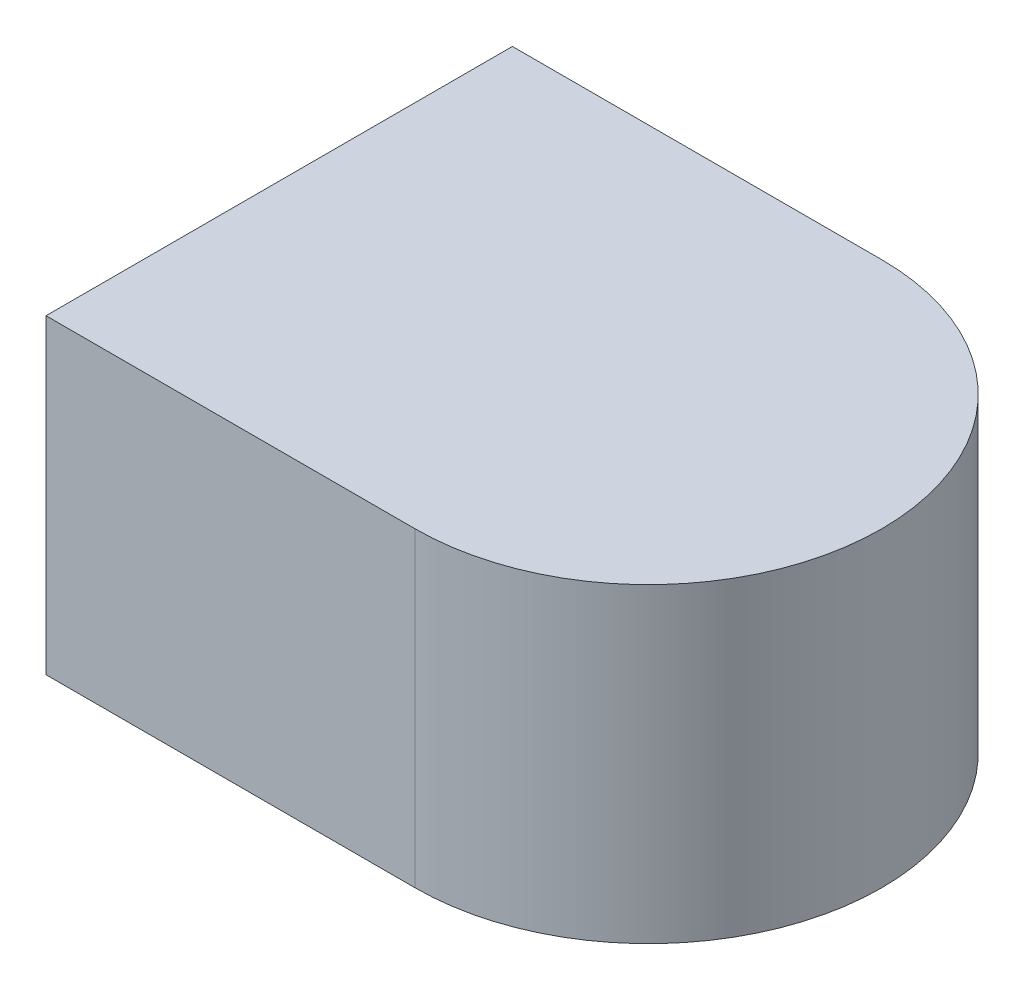
ISO-10303-21;
HEADER;
FILE_DESCRIPTION(('STEP AP214'),'2;1');
FILE_NAME('part.step','',(''),(''),'','','');
FILE_SCHEMA(('AUTOMOTIVE_DESIGN { 1 0 10303 214 1 1 1 1 }'));
ENDSEC;
DATA;
#1=APPLICATION_CONTEXT('core data for automotive mechanical design processes');
#2=APPLICATION_PROTOCOL_DEFINITION('international standard','automotive_design',2000,#1);
#3=PRODUCT_CONTEXT('',#1,'mechanical');
#4=PRODUCT('Part','Part','',(#3));
#5=PRODUCT_RELATED_PRODUCT_CATEGORY('part','',(#4));
#6=PRODUCT_DEFINITION_FORMATION('','',#4);
#7=PRODUCT_DEFINITION_CONTEXT('part definition',#1,'design');
#8=PRODUCT_DEFINITION('design','',#6,#7);
#9=PRODUCT_DEFINITION_SHAPE('','',#8);
#10=(LENGTH_UNIT() NAMED_UNIT(*) SI_UNIT(.MILLI.,.METRE.));
#11=(NAMED_UNIT(*) PLANE_ANGLE_UNIT() SI_UNIT($,.RADIAN.));
#12=(NAMED_UNIT(*) SI_UNIT($,.STERADIAN.) SOLID_ANGLE_UNIT());
#13=UNCERTAINTY_MEASURE_WITH_UNIT(LENGTH_MEASURE(1.E-05),#10,'distance_accuracy_value','');
#14=(GEOMETRIC_REPRESENTATION_CONTEXT(3) GLOBAL_UNCERTAINTY_ASSIGNED_CONTEXT((#13)) GLOBAL_UNIT_ASSIGNED_CONTEXT((#10,
#11,#12)) REPRESENTATION_CONTEXT('',''));
#15=CARTESIAN_POINT('',(0.,0.,0.));
#16=DIRECTION('',(0.,0.,1.));
#17=DIRECTION('',(1.,0.,0.));
#18=AXIS2_PLACEMENT_3D('',#15,#16,#17);
#19=CARTESIAN_POINT('',(-3.32873244431996,0.,6.));
#20=DIRECTION('',(0.,-1.,0.));
#21=DIRECTION('',(0.,0.,-1.));
#22=AXIS2_PLACEMENT_3D('',#19,#20,#21);
#23=PLANE('',#22);
#24=CARTESIAN_POINT('',(0.,0.,6.));
#25=DIRECTION('',(0.,1.,0.));
#26=DIRECTION('',(-1.,0.,0.));
#27=AXIS2_PLACEMENT_3D('',#24,#25,#26);
#28=CIRCLE('',#27,4.1);
#29=CARTESIAN_POINT('',(4.1,0.,6.));
#30=VERTEX_POINT('',#29);
#31=EDGE_CURVE('E109',#30,#30,#28,.T.);
#32=ORIENTED_EDGE('',*,*,#31,.T.);
#33=EDGE_LOOP('',(#32));
#34=FACE_BOUND('',#33,.T.);
#35=DIRECTION('',(-1.,0.,0.));
#36=VECTOR('',#35,1.);
#37=CARTESIAN_POINT('',(0.,0.,0.));
#38=LINE('',#37,#36);
#39=CARTESIAN_POINT('',(0.,0.,0.));
#40=VERTEX_POINT('',#39);
#41=CARTESIAN_POINT('',(-9.5,0.,0.));
#42=VERTEX_POINT('',#41);
#43=EDGE_CURVE('E27',#40,#42,#38,.T.);
#44=ORIENTED_EDGE('',*,*,#43,.F.);
#45=CARTESIAN_POINT('',(0.,0.,6.));
#46=DIRECTION('',(0.,1.,0.));
#47=DIRECTION('',(0.,0.,1.));
#48=AXIS2_PLACEMENT_3D('',#45,#46,#47);
#49=CIRCLE('',#48,6.);
#50=CARTESIAN_POINT('',(0.,0.,12.));
#51=VERTEX_POINT('',#50);
#52=EDGE_CURVE('E119',#51,#40,#49,.T.);
#53=ORIENTED_EDGE('',*,*,#52,.F.);
#54=DIRECTION('',(1.,0.,0.));
#55=VECTOR('',#54,1.);
#56=CARTESIAN_POINT('',(-9.5,0.,12.));
#57=LINE('',#56,#55);
#58=CARTESIAN_POINT('',(-9.5,0.,12.));
#59=VERTEX_POINT('',#58);
#60=EDGE_CURVE('E69',#59,#51,#57,.T.);
#61=ORIENTED_EDGE('',*,*,#60,.F.);
#62=DIRECTION('',(0.,0.,1.));
#63=VECTOR('',#62,1.);
#64=CARTESIAN_POINT('',(-9.5,0.,0.));
#65=LINE('',#64,#63);
#66=EDGE_CURVE('E20',#42,#59,#65,.T.);
#67=ORIENTED_EDGE('',*,*,#66,.F.);
#68=EDGE_LOOP('',(#44,#53,#61,#67));
#69=FACE_BOUND('',#68,.T.);
#70=ADVANCED_FACE('F16',(#34,#69),#23,.T.);
#71=CARTESIAN_POINT('',(-3.32873244431996,8.,6.));
#72=DIRECTION('',(0.,-1.,0.));
#73=DIRECTION('',(0.,0.,-1.));
#74=AXIS2_PLACEMENT_3D('',#71,#72,#73);
#75=PLANE('',#74);
#76=DIRECTION('',(-1.,0.,0.));
#77=VECTOR('',#76,1.);
#78=CARTESIAN_POINT('',(0.,8.,0.));
#79=LINE('',#78,#77);
#80=CARTESIAN_POINT('',(0.,8.,0.));
#81=VERTEX_POINT('',#80);
#82=CARTESIAN_POINT('',(-9.5,8.,0.));
#83=VERTEX_POINT('',#82);
#84=EDGE_CURVE('E11',#81,#83,#79,.T.);
#85=ORIENTED_EDGE('',*,*,#84,.T.);
#86=DIRECTION('',(0.,0.,1.));
#87=VECTOR('',#86,1.);
#88=CARTESIAN_POINT('',(-9.5,8.,0.));
#89=LINE('',#88,#87);
#90=CARTESIAN_POINT('',(-9.5,8.,12.));
#91=VERTEX_POINT('',#90);
#92=EDGE_CURVE('E132',#83,#91,#89,.T.);
#93=ORIENTED_EDGE('',*,*,#92,.T.);
#94=DIRECTION('',(1.,0.,0.));
#95=VECTOR('',#94,1.);
#96=CARTESIAN_POINT('',(-9.5,8.,12.));
#97=LINE('',#96,#95);
#98=CARTESIAN_POINT('',(0.,8.,12.));
#99=VERTEX_POINT('',#98);
#100=EDGE_CURVE('E115',#91,#99,#97,.T.);
#101=ORIENTED_EDGE('',*,*,#100,.T.);
#102=CARTESIAN_POINT('',(0.,8.,6.));
#103=DIRECTION('',(0.,1.,0.));
#104=DIRECTION('',(0.,0.,1.));
#105=AXIS2_PLACEMENT_3D('',#102,#103,#104);
#106=CIRCLE('',#105,6.);
#107=EDGE_CURVE('E149',#99,#81,#106,.T.);
#108=ORIENTED_EDGE('',*,*,#107,.T.);
#109=EDGE_LOOP('',(#85,#93,#101,#108));
#110=FACE_BOUND('',#109,.T.);
#111=ADVANCED_FACE('F179',(#110),#75,.F.);
#112=CARTESIAN_POINT('',(0.,0.,0.));
#113=DIRECTION('',(0.,0.,-1.));
#114=DIRECTION('',(0.,-1.,0.));
#115=AXIS2_PLACEMENT_3D('',#112,#113,#114);
#116=PLANE('',#115);
#117=ORIENTED_EDGE('',*,*,#43,.T.);
#118=DIRECTION('',(0.,1.,0.));
#119=VECTOR('',#118,1.);
#120=CARTESIAN_POINT('',(-9.5,0.,0.));
#121=LINE('',#120,#119);
#122=EDGE_CURVE('E125',#42,#83,#121,.T.);
#123=ORIENTED_EDGE('',*,*,#122,.T.);
#124=ORIENTED_EDGE('',*,*,#84,.F.);
#125=DIRECTION('',(0.,1.,0.));
#126=VECTOR('',#125,1.);
#127=CARTESIAN_POINT('',(0.,0.,0.));
#128=LINE('',#127,#126);
#129=EDGE_CURVE('E113',#40,#81,#128,.T.);
#130=ORIENTED_EDGE('',*,*,#129,.F.);
#131=EDGE_LOOP('',(#117,#123,#124,#130));
#132=FACE_BOUND('',#131,.T.);
#133=ADVANCED_FACE('F184',(#132),#116,.T.);
#134=CARTESIAN_POINT('',(-9.5,0.,0.));
#135=DIRECTION('',(-1.,0.,0.));
#136=DIRECTION('',(0.,0.,1.));
#137=AXIS2_PLACEMENT_3D('',#134,#135,#136);
#138=PLANE('',#137);
#139=CARTESIAN_POINT('',(-9.5,4.,6.));
#140=DIRECTION('',(1.,0.,0.));
#141=DIRECTION('',(0.,0.,-1.));
#142=AXIS2_PLACEMENT_3D('',#139,#140,#141);
#143=CIRCLE('',#142,2.);
#144=CARTESIAN_POINT('',(-9.5,4.,8.));
#145=VERTEX_POINT('',#144);
#146=EDGE_CURVE('E97',#145,#145,#143,.T.);
#147=ORIENTED_EDGE('',*,*,#146,.T.);
#148=EDGE_LOOP('',(#147));
#149=FACE_BOUND('',#148,.T.);
#150=ORIENTED_EDGE('',*,*,#66,.T.);
#151=DIRECTION('',(0.,1.,0.));
#152=VECTOR('',#151,1.);
#153=CARTESIAN_POINT('',(-9.5,0.,12.));
#154=LINE('',#153,#152);
#155=EDGE_CURVE('E118',#59,#91,#154,.T.);
#156=ORIENTED_EDGE('',*,*,#155,.T.);
#157=ORIENTED_EDGE('',*,*,#92,.F.);
#158=ORIENTED_EDGE('',*,*,#122,.F.);
#159=EDGE_LOOP('',(#150,#156,#157,#158));
#160=FACE_BOUND('',#159,.T.);
#161=ADVANCED_FACE('F98',(#149,#160),#138,.T.);
#162=CARTESIAN_POINT('',(-9.5,0.,12.));
#163=DIRECTION('',(0.,0.,1.));
#164=DIRECTION('',(1.,0.,0.));
#165=AXIS2_PLACEMENT_3D('',#162,#163,#164);
#166=PLANE('',#165);
#167=ORIENTED_EDGE('',*,*,#60,.T.);
#168=DIRECTION('',(0.,1.,0.));
#169=VECTOR('',#168,1.);
#170=CARTESIAN_POINT('',(0.,0.,12.));
#171=LINE('',#170,#169);
#172=EDGE_CURVE('E127',#51,#99,#171,.T.);
#173=ORIENTED_EDGE('',*,*,#172,.T.);
#174=ORIENTED_EDGE('',*,*,#100,.F.);
#175=ORIENTED_EDGE('',*,*,#155,.F.);
#176=EDGE_LOOP('',(#167,#173,#174,#175));
#177=FACE_BOUND('',#176,.T.);
#178=ADVANCED_FACE('F144',(#177),#166,.T.);
#179=CARTESIAN_POINT('',(0.,0.,6.));
#180=DIRECTION('',(0.,1.,0.));
#181=DIRECTION('',(0.,0.,1.));
#182=AXIS2_PLACEMENT_3D('',#179,#180,#181);
#183=CYLINDRICAL_SURFACE('',#182,6.);
#184=ORIENTED_EDGE('',*,*,#52,.T.);
#185=ORIENTED_EDGE('',*,*,#129,.T.);
#186=ORIENTED_EDGE('',*,*,#107,.F.);
#187=ORIENTED_EDGE('',*,*,#172,.F.);
#188=EDGE_LOOP('',(#184,#185,#186,#187));
#189=FACE_BOUND('',#188,.T.);
#190=ADVANCED_FACE('F147',(#189),#183,.T.);
#191=CARTESIAN_POINT('',(0.,5.,6.));
#192=DIRECTION('',(0.,1.,0.));
#193=DIRECTION('',(1.,0.,0.));
#194=AXIS2_PLACEMENT_3D('',#191,#192,#193);
#195=PLANE('',#194);
#196=CARTESIAN_POINT('',(0.,5.,6.));
#197=DIRECTION('',(0.,1.,0.));
#198=DIRECTION('',(-1.,0.,0.));
#199=AXIS2_PLACEMENT_3D('',#196,#197,#198);
#200=CIRCLE('',#199,4.1);
#201=CARTESIAN_POINT('',(4.1,5.,6.));
#202=VERTEX_POINT('',#201);
#203=EDGE_CURVE('E92',#202,#202,#200,.T.);
#204=ORIENTED_EDGE('',*,*,#203,.F.);
#205=EDGE_LOOP('',(#204));
#206=FACE_BOUND('',#205,.T.);
#207=ADVANCED_FACE('F165',(#206),#195,.F.);
#208=CARTESIAN_POINT('',(0.,0.,6.));
#209=DIRECTION('',(0.,1.,0.));
#210=DIRECTION('',(-1.,0.,0.));
#211=AXIS2_PLACEMENT_3D('',#208,#209,#210);
#212=CYLINDRICAL_SURFACE('',#211,4.1);
#213=ORIENTED_EDGE('',*,*,#31,.F.);
#214=EDGE_LOOP('',(#213));
#215=FACE_BOUND('',#214,.T.);
#216=ORIENTED_EDGE('',*,*,#203,.T.);
#217=EDGE_LOOP('',(#216));
#218=FACE_BOUND('',#217,.T.);
#219=ADVANCED_FACE('F162',(#215,#218),#212,.F.);
#220=CARTESIAN_POINT('',(-4.5,4.,6.));
#221=DIRECTION('',(1.,0.,0.));
#222=DIRECTION('',(0.,1.,0.));
#223=AXIS2_PLACEMENT_3D('',#220,#221,#222);
#224=PLANE('',#223);
#225=CARTESIAN_POINT('',(-4.5,4.,6.));
#226=DIRECTION('',(1.,0.,0.));
#227=DIRECTION('',(0.,0.,-1.));
#228=AXIS2_PLACEMENT_3D('',#225,#226,#227);
#229=CIRCLE('',#228,2.);
#230=CARTESIAN_POINT('',(-4.5,4.,8.));
#231=VERTEX_POINT('',#230);
#232=EDGE_CURVE('E102',#231,#231,#229,.T.);
#233=ORIENTED_EDGE('',*,*,#232,.F.);
#234=EDGE_LOOP('',(#233));
#235=FACE_BOUND('',#234,.T.);
#236=ADVANCED_FACE('F164',(#235),#224,.F.);
#237=CARTESIAN_POINT('',(-9.5,4.,6.));
#238=DIRECTION('',(1.,0.,0.));
#239=DIRECTION('',(0.,0.,-1.));
#240=AXIS2_PLACEMENT_3D('',#237,#238,#239);
#241=CYLINDRICAL_SURFACE('',#240,2.);
#242=ORIENTED_EDGE('',*,*,#146,.F.);
#243=EDGE_LOOP('',(#242));
#244=FACE_BOUND('',#243,.T.);
#245=ORIENTED_EDGE('',*,*,#232,.T.);
#246=EDGE_LOOP('',(#245));
#247=FACE_BOUND('',#246,.T.);
#248=ADVANCED_FACE('F18',(#244,#247),#241,.F.);
#249=CLOSED_SHELL('',(#70,#111,#133,#161,#178,#190,#207,#219,#236,#248));
#250=MANIFOLD_SOLID_BREP('B1',#249);
#251=ADVANCED_BREP_SHAPE_REPRESENTATION('',(#18,#250),#14);
#252=SHAPE_DEFINITION_REPRESENTATION(#9,#251);
ENDSEC;
END-ISO-10303-21;
